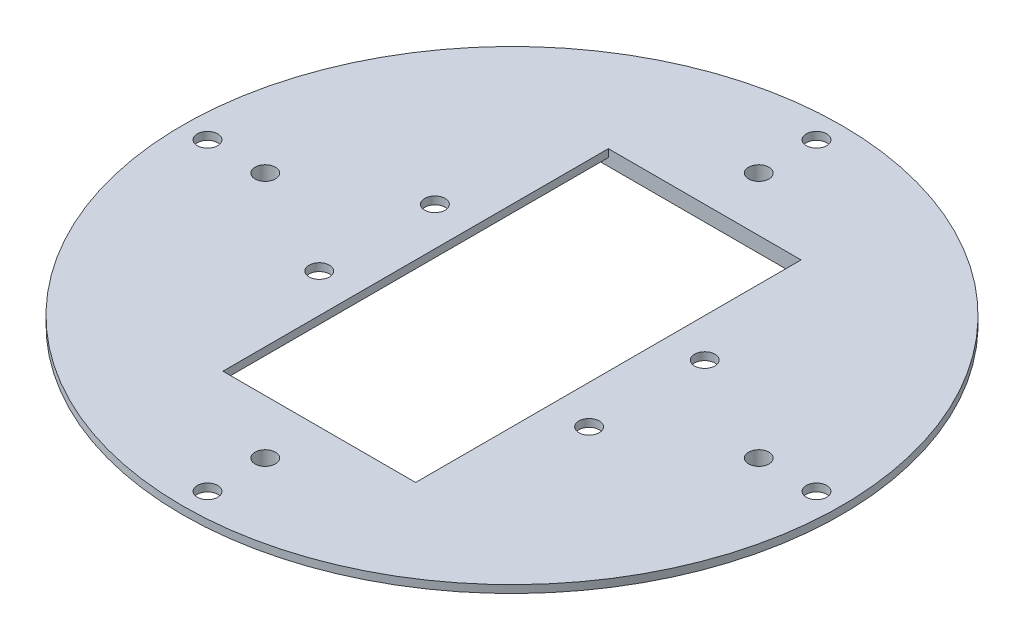
ISO-10303-21;
HEADER;
FILE_DESCRIPTION(('STEP AP214'),'2;1');
FILE_NAME('part.step','',(''),(''),'','','');
FILE_SCHEMA(('AUTOMOTIVE_DESIGN { 1 0 10303 214 1 1 1 1 }'));
ENDSEC;
DATA;
#1=APPLICATION_CONTEXT('core data for automotive mechanical design processes');
#2=APPLICATION_PROTOCOL_DEFINITION('international standard','automotive_design',2000,#1);
#3=PRODUCT_CONTEXT('',#1,'mechanical');
#4=PRODUCT('Part','Part','',(#3));
#5=PRODUCT_RELATED_PRODUCT_CATEGORY('part','',(#4));
#6=PRODUCT_DEFINITION_FORMATION('','',#4);
#7=PRODUCT_DEFINITION_CONTEXT('part definition',#1,'design');
#8=PRODUCT_DEFINITION('design','',#6,#7);
#9=PRODUCT_DEFINITION_SHAPE('','',#8);
#10=(LENGTH_UNIT() NAMED_UNIT(*) SI_UNIT(.MILLI.,.METRE.));
#11=(NAMED_UNIT(*) PLANE_ANGLE_UNIT() SI_UNIT($,.RADIAN.));
#12=(NAMED_UNIT(*) SI_UNIT($,.STERADIAN.) SOLID_ANGLE_UNIT());
#13=UNCERTAINTY_MEASURE_WITH_UNIT(LENGTH_MEASURE(1.E-05),#10,'distance_accuracy_value','');
#14=(GEOMETRIC_REPRESENTATION_CONTEXT(3) GLOBAL_UNCERTAINTY_ASSIGNED_CONTEXT((#13)) GLOBAL_UNIT_ASSIGNED_CONTEXT((#10,
#11,#12)) REPRESENTATION_CONTEXT('',''));
#15=CARTESIAN_POINT('',(0.,0.,0.));
#16=DIRECTION('',(0.,0.,1.));
#17=DIRECTION('',(1.,0.,0.));
#18=AXIS2_PLACEMENT_3D('',#15,#16,#17);
#19=CARTESIAN_POINT('',(0.,0.,0.));
#20=DIRECTION('',(0.,1.,0.));
#21=DIRECTION('',(0.,0.,1.));
#22=AXIS2_PLACEMENT_3D('',#19,#20,#21);
#23=PLANE('',#22);
#24=CARTESIAN_POINT('',(0.,0.,-79.));
#25=DIRECTION('',(0.,1.,0.));
#26=DIRECTION('',(0.,0.,1.));
#27=AXIS2_PLACEMENT_3D('',#24,#25,#26);
#28=CIRCLE('',#27,2.65);
#29=CARTESIAN_POINT('',(0.,0.,-76.35));
#30=VERTEX_POINT('',#29);
#31=EDGE_CURVE('E256',#30,#30,#28,.T.);
#32=ORIENTED_EDGE('',*,*,#31,.T.);
#33=EDGE_LOOP('',(#32));
#34=FACE_BOUND('',#33,.T.);
#35=CARTESIAN_POINT('',(-79.,0.,-8.27481077305823E-13));
#36=DIRECTION('',(0.,1.,0.));
#37=DIRECTION('',(0.,0.,1.));
#38=AXIS2_PLACEMENT_3D('',#35,#36,#37);
#39=CIRCLE('',#38,2.65);
#40=CARTESIAN_POINT('',(-79.,0.,2.64999999999917));
#41=VERTEX_POINT('',#40);
#42=EDGE_CURVE('E280',#41,#41,#39,.T.);
#43=ORIENTED_EDGE('',*,*,#42,.T.);
#44=EDGE_LOOP('',(#43));
#45=FACE_BOUND('',#44,.T.);
#46=CARTESIAN_POINT('',(-5.51654051537215E-13,0.,79.));
#47=DIRECTION('',(0.,1.,0.));
#48=DIRECTION('',(0.,0.,1.));
#49=AXIS2_PLACEMENT_3D('',#46,#47,#48);
#50=CIRCLE('',#49,2.65);
#51=CARTESIAN_POINT('',(-5.51654051537215E-13,0.,81.65));
#52=VERTEX_POINT('',#51);
#53=EDGE_CURVE('E284',#52,#52,#50,.T.);
#54=ORIENTED_EDGE('',*,*,#53,.T.);
#55=EDGE_LOOP('',(#54));
#56=FACE_BOUND('',#55,.T.);
#57=CARTESIAN_POINT('',(79.,0.,2.75827025768608E-13));
#58=DIRECTION('',(0.,1.,0.));
#59=DIRECTION('',(0.,0.,1.));
#60=AXIS2_PLACEMENT_3D('',#57,#58,#59);
#61=CIRCLE('',#60,2.65);
#62=CARTESIAN_POINT('',(79.,0.,2.65000000000027));
#63=VERTEX_POINT('',#62);
#64=EDGE_CURVE('E287',#63,#63,#61,.T.);
#65=ORIENTED_EDGE('',*,*,#64,.T.);
#66=EDGE_LOOP('',(#65));
#67=FACE_BOUND('',#66,.T.);
#68=CARTESIAN_POINT('',(0.,0.,0.));
#69=DIRECTION('',(0.,1.,0.));
#70=DIRECTION('',(0.,0.,1.));
#71=AXIS2_PLACEMENT_3D('',#68,#69,#70);
#72=CIRCLE('',#71,85.5);
#73=CARTESIAN_POINT('',(0.,0.,85.5));
#74=VERTEX_POINT('',#73);
#75=EDGE_CURVE('E51',#74,#74,#72,.T.);
#76=ORIENTED_EDGE('',*,*,#75,.F.);
#77=EDGE_LOOP('',(#76));
#78=FACE_BOUND('',#77,.T.);
#79=CARTESIAN_POINT('',(0.,0.,0.));
#80=DIRECTION('',(0.,-1.,0.));
#81=DIRECTION('',(0.,0.,-1.));
#82=AXIS2_PLACEMENT_3D('',#79,#80,#81);
#83=CIRCLE('',#82,72.5);
#84=CARTESIAN_POINT('',(0.,0.,-72.5));
#85=VERTEX_POINT('',#84);
#86=EDGE_CURVE('E11',#85,#85,#83,.T.);
#87=ORIENTED_EDGE('',*,*,#86,.F.);
#88=EDGE_LOOP('',(#87));
#89=FACE_BOUND('',#88,.T.);
#90=ADVANCED_FACE('F47',(#34,#45,#56,#67,#78,#89),#23,.F.);
#91=CARTESIAN_POINT('',(-34.9999999999999,0.,15.0000000000002));
#92=DIRECTION('',(0.,1.,0.));
#93=DIRECTION('',(0.,0.,1.));
#94=AXIS2_PLACEMENT_3D('',#91,#92,#93);
#95=CIRCLE('',#94,2.65);
#96=CARTESIAN_POINT('',(-34.9999999999999,0.,17.6500000000002));
#97=VERTEX_POINT('',#96);
#98=EDGE_CURVE('E182',#97,#97,#95,.T.);
#99=ORIENTED_EDGE('',*,*,#98,.T.);
#100=EDGE_LOOP('',(#99));
#101=FACE_BOUND('',#100,.T.);
#102=CARTESIAN_POINT('',(-35.0000000000001,0.,-14.9999999999996));
#103=DIRECTION('',(0.,1.,0.));
#104=DIRECTION('',(0.,0.,1.));
#105=AXIS2_PLACEMENT_3D('',#102,#103,#104);
#106=CIRCLE('',#105,2.65);
#107=CARTESIAN_POINT('',(-35.0000000000001,0.,-12.3499999999996));
#108=VERTEX_POINT('',#107);
#109=EDGE_CURVE('E198',#108,#108,#106,.F.);
#110=ORIENTED_EDGE('',*,*,#109,.F.);
#111=EDGE_LOOP('',(#110));
#112=FACE_BOUND('',#111,.T.);
#113=DIRECTION('',(0.,0.,-1.));
#114=VECTOR('',#113,1.);
#115=CARTESIAN_POINT('',(-25.,0.,0.));
#116=LINE('',#115,#114);
#117=CARTESIAN_POINT('',(-25.,0.,50.));
#118=VERTEX_POINT('',#117);
#119=CARTESIAN_POINT('',(-25.,0.,-50.));
#120=VERTEX_POINT('',#119);
#121=EDGE_CURVE('E206',#118,#120,#116,.T.);
#122=ORIENTED_EDGE('',*,*,#121,.F.);
#123=DIRECTION('',(-1.,0.,0.));
#124=VECTOR('',#123,1.);
#125=CARTESIAN_POINT('',(-50.,0.,50.));
#126=LINE('',#125,#124);
#127=CARTESIAN_POINT('',(-50.,0.,50.));
#128=VERTEX_POINT('',#127);
#129=EDGE_CURVE('E57',#118,#128,#126,.T.);
#130=ORIENTED_EDGE('',*,*,#129,.T.);
#131=DIRECTION('',(0.,0.,-1.));
#132=VECTOR('',#131,1.);
#133=CARTESIAN_POINT('',(-50.,0.,-50.));
#134=LINE('',#133,#132);
#135=CARTESIAN_POINT('',(-50.,0.,-50.));
#136=VERTEX_POINT('',#135);
#137=EDGE_CURVE('E156',#128,#136,#134,.T.);
#138=ORIENTED_EDGE('',*,*,#137,.T.);
#139=DIRECTION('',(1.,0.,0.));
#140=VECTOR('',#139,1.);
#141=CARTESIAN_POINT('',(-50.,0.,-50.));
#142=LINE('',#141,#140);
#143=EDGE_CURVE('E125',#136,#120,#142,.T.);
#144=ORIENTED_EDGE('',*,*,#143,.T.);
#145=EDGE_LOOP('',(#122,#130,#138,#144));
#146=FACE_BOUND('',#145,.T.);
#147=ADVANCED_FACE('F300',(#101,#112,#146),#23,.F.);
#148=CARTESIAN_POINT('',(0.,2.,0.));
#149=DIRECTION('',(0.,1.,0.));
#150=DIRECTION('',(0.,0.,1.));
#151=AXIS2_PLACEMENT_3D('',#148,#149,#150);
#152=PLANE('',#151);
#153=CARTESIAN_POINT('',(35.,2.,15.));
#154=DIRECTION('',(0.,1.,0.));
#155=DIRECTION('',(0.,0.,1.));
#156=AXIS2_PLACEMENT_3D('',#153,#154,#155);
#157=CIRCLE('',#156,2.65);
#158=CARTESIAN_POINT('',(35.,2.,17.65));
#159=VERTEX_POINT('',#158);
#160=EDGE_CURVE('E172',#159,#159,#157,.F.);
#161=ORIENTED_EDGE('',*,*,#160,.T.);
#162=EDGE_LOOP('',(#161));
#163=FACE_BOUND('',#162,.T.);
#164=CARTESIAN_POINT('',(-35.0000000000001,2.,-14.9999999999996));
#165=DIRECTION('',(0.,1.,0.));
#166=DIRECTION('',(0.,0.,1.));
#167=AXIS2_PLACEMENT_3D('',#164,#165,#166);
#168=CIRCLE('',#167,2.65);
#169=CARTESIAN_POINT('',(-35.0000000000001,2.,-12.3499999999996));
#170=VERTEX_POINT('',#169);
#171=EDGE_CURVE('E186',#170,#170,#168,.F.);
#172=ORIENTED_EDGE('',*,*,#171,.T.);
#173=EDGE_LOOP('',(#172));
#174=FACE_BOUND('',#173,.T.);
#175=DIRECTION('',(0.,0.,-1.));
#176=VECTOR('',#175,1.);
#177=CARTESIAN_POINT('',(-25.,2.,0.));
#178=LINE('',#177,#176);
#179=CARTESIAN_POINT('',(-25.,2.,50.));
#180=VERTEX_POINT('',#179);
#181=CARTESIAN_POINT('',(-25.,2.,-50.));
#182=VERTEX_POINT('',#181);
#183=EDGE_CURVE('E211',#180,#182,#178,.T.);
#184=ORIENTED_EDGE('',*,*,#183,.T.);
#185=DIRECTION('',(1.,0.,0.));
#186=VECTOR('',#185,1.);
#187=CARTESIAN_POINT('',(0.,2.,-50.));
#188=LINE('',#187,#186);
#189=CARTESIAN_POINT('',(25.,2.,-50.));
#190=VERTEX_POINT('',#189);
#191=EDGE_CURVE('E239',#182,#190,#188,.T.);
#192=ORIENTED_EDGE('',*,*,#191,.T.);
#193=DIRECTION('',(0.,0.,-1.));
#194=VECTOR('',#193,1.);
#195=CARTESIAN_POINT('',(25.,2.,0.));
#196=LINE('',#195,#194);
#197=CARTESIAN_POINT('',(25.,2.,50.));
#198=VERTEX_POINT('',#197);
#199=EDGE_CURVE('E202',#198,#190,#196,.T.);
#200=ORIENTED_EDGE('',*,*,#199,.F.);
#201=DIRECTION('',(1.,0.,0.));
#202=VECTOR('',#201,1.);
#203=CARTESIAN_POINT('',(0.,2.,50.));
#204=LINE('',#203,#202);
#205=EDGE_CURVE('E253',#180,#198,#204,.T.);
#206=ORIENTED_EDGE('',*,*,#205,.F.);
#207=EDGE_LOOP('',(#184,#192,#200,#206));
#208=FACE_BOUND('',#207,.T.);
#209=CARTESIAN_POINT('',(0.,2.,-64.0312423743285));
#210=DIRECTION('',(0.,1.,0.));
#211=DIRECTION('',(0.,0.,1.));
#212=AXIS2_PLACEMENT_3D('',#209,#210,#211);
#213=CIRCLE('',#212,2.65);
#214=CARTESIAN_POINT('',(0.,2.,-61.3812423743285));
#215=VERTEX_POINT('',#214);
#216=EDGE_CURVE('E235',#215,#215,#213,.T.);
#217=ORIENTED_EDGE('',*,*,#216,.F.);
#218=EDGE_LOOP('',(#217));
#219=FACE_BOUND('',#218,.T.);
#220=CARTESIAN_POINT('',(-64.0312423743285,2.,-6.70691663558729E-13));
#221=DIRECTION('',(0.,1.,0.));
#222=DIRECTION('',(0.,0.,1.));
#223=AXIS2_PLACEMENT_3D('',#220,#221,#222);
#224=CIRCLE('',#223,2.65);
#225=CARTESIAN_POINT('',(-64.0312423743285,2.,2.64999999999933));
#226=VERTEX_POINT('',#225);
#227=EDGE_CURVE('E240',#226,#226,#224,.T.);
#228=ORIENTED_EDGE('',*,*,#227,.F.);
#229=EDGE_LOOP('',(#228));
#230=FACE_BOUND('',#229,.T.);
#231=CARTESIAN_POINT('',(64.0312423743285,2.,2.2356388785291E-13));
#232=DIRECTION('',(0.,1.,0.));
#233=DIRECTION('',(0.,0.,1.));
#234=AXIS2_PLACEMENT_3D('',#231,#232,#233);
#235=CIRCLE('',#234,2.65);
#236=CARTESIAN_POINT('',(64.0312423743285,2.,2.65000000000022));
#237=VERTEX_POINT('',#236);
#238=EDGE_CURVE('E244',#237,#237,#235,.T.);
#239=ORIENTED_EDGE('',*,*,#238,.F.);
#240=EDGE_LOOP('',(#239));
#241=FACE_BOUND('',#240,.T.);
#242=CARTESIAN_POINT('',(-4.47127775705819E-13,2.,64.0312423743285));
#243=DIRECTION('',(0.,1.,0.));
#244=DIRECTION('',(0.,0.,1.));
#245=AXIS2_PLACEMENT_3D('',#242,#243,#244);
#246=CIRCLE('',#245,2.65);
#247=CARTESIAN_POINT('',(-4.47127775705819E-13,2.,66.6812423743285));
#248=VERTEX_POINT('',#247);
#249=EDGE_CURVE('E218',#248,#248,#246,.T.);
#250=ORIENTED_EDGE('',*,*,#249,.F.);
#251=EDGE_LOOP('',(#250));
#252=FACE_BOUND('',#251,.T.);
#253=CARTESIAN_POINT('',(0.,2.,-79.));
#254=DIRECTION('',(0.,1.,0.));
#255=DIRECTION('',(0.,0.,1.));
#256=AXIS2_PLACEMENT_3D('',#253,#254,#255);
#257=CIRCLE('',#256,2.65);
#258=CARTESIAN_POINT('',(0.,2.,-76.35));
#259=VERTEX_POINT('',#258);
#260=EDGE_CURVE('E257',#259,#259,#257,.T.);
#261=ORIENTED_EDGE('',*,*,#260,.F.);
#262=EDGE_LOOP('',(#261));
#263=FACE_BOUND('',#262,.T.);
#264=CARTESIAN_POINT('',(-79.,2.,-8.27481077305823E-13));
#265=DIRECTION('',(0.,1.,0.));
#266=DIRECTION('',(0.,0.,1.));
#267=AXIS2_PLACEMENT_3D('',#264,#265,#266);
#268=CIRCLE('',#267,2.65);
#269=CARTESIAN_POINT('',(-79.,2.,2.64999999999917));
#270=VERTEX_POINT('',#269);
#271=EDGE_CURVE('E261',#270,#270,#268,.T.);
#272=ORIENTED_EDGE('',*,*,#271,.F.);
#273=EDGE_LOOP('',(#272));
#274=FACE_BOUND('',#273,.T.);
#275=CARTESIAN_POINT('',(-5.51654051537215E-13,2.,79.));
#276=DIRECTION('',(0.,1.,0.));
#277=DIRECTION('',(0.,0.,1.));
#278=AXIS2_PLACEMENT_3D('',#275,#276,#277);
#279=CIRCLE('',#278,2.65);
#280=CARTESIAN_POINT('',(-5.51654051537215E-13,2.,81.65));
#281=VERTEX_POINT('',#280);
#282=EDGE_CURVE('E265',#281,#281,#279,.T.);
#283=ORIENTED_EDGE('',*,*,#282,.F.);
#284=EDGE_LOOP('',(#283));
#285=FACE_BOUND('',#284,.T.);
#286=CARTESIAN_POINT('',(79.,2.,2.75827025768608E-13));
#287=DIRECTION('',(0.,1.,0.));
#288=DIRECTION('',(0.,0.,1.));
#289=AXIS2_PLACEMENT_3D('',#286,#287,#288);
#290=CIRCLE('',#289,2.65);
#291=CARTESIAN_POINT('',(79.,2.,2.65000000000027));
#292=VERTEX_POINT('',#291);
#293=EDGE_CURVE('E269',#292,#292,#290,.T.);
#294=ORIENTED_EDGE('',*,*,#293,.F.);
#295=EDGE_LOOP('',(#294));
#296=FACE_BOUND('',#295,.T.);
#297=CARTESIAN_POINT('',(0.,2.,0.));
#298=DIRECTION('',(0.,1.,0.));
#299=DIRECTION('',(0.,0.,1.));
#300=AXIS2_PLACEMENT_3D('',#297,#298,#299);
#301=CIRCLE('',#300,85.5);
#302=CARTESIAN_POINT('',(0.,2.,85.5));
#303=VERTEX_POINT('',#302);
#304=EDGE_CURVE('E273',#303,#303,#301,.T.);
#305=ORIENTED_EDGE('',*,*,#304,.T.);
#306=EDGE_LOOP('',(#305));
#307=FACE_BOUND('',#306,.T.);
#308=CARTESIAN_POINT('',(35.,2.,-15.));
#309=DIRECTION('',(0.,1.,0.));
#310=DIRECTION('',(0.,0.,1.));
#311=AXIS2_PLACEMENT_3D('',#308,#309,#310);
#312=CIRCLE('',#311,2.65);
#313=CARTESIAN_POINT('',(35.,2.,-12.35));
#314=VERTEX_POINT('',#313);
#315=EDGE_CURVE('E178',#314,#314,#312,.T.);
#316=ORIENTED_EDGE('',*,*,#315,.F.);
#317=EDGE_LOOP('',(#316));
#318=FACE_BOUND('',#317,.T.);
#319=CARTESIAN_POINT('',(-34.9999999999999,2.,15.0000000000002));
#320=DIRECTION('',(0.,1.,0.));
#321=DIRECTION('',(0.,0.,1.));
#322=AXIS2_PLACEMENT_3D('',#319,#320,#321);
#323=CIRCLE('',#322,2.65);
#324=CARTESIAN_POINT('',(-34.9999999999999,2.,17.6500000000002));
#325=VERTEX_POINT('',#324);
#326=EDGE_CURVE('E187',#325,#325,#323,.T.);
#327=ORIENTED_EDGE('',*,*,#326,.F.);
#328=EDGE_LOOP('',(#327));
#329=FACE_BOUND('',#328,.T.);
#330=ADVANCED_FACE('F366',(#163,#174,#208,#219,#230,#241,#252,#263,#274,#285,#296,#307,#318,
#329),#152,.T.);
#331=CARTESIAN_POINT('',(35.,0.,-15.));
#332=DIRECTION('',(0.,1.,0.));
#333=DIRECTION('',(0.,0.,1.));
#334=AXIS2_PLACEMENT_3D('',#331,#332,#333);
#335=CIRCLE('',#334,2.65);
#336=CARTESIAN_POINT('',(35.,0.,-12.35));
#337=VERTEX_POINT('',#336);
#338=EDGE_CURVE('E191',#337,#337,#335,.T.);
#339=ORIENTED_EDGE('',*,*,#338,.T.);
#340=EDGE_LOOP('',(#339));
#341=FACE_BOUND('',#340,.T.);
#342=CARTESIAN_POINT('',(35.,0.,15.));
#343=DIRECTION('',(0.,1.,0.));
#344=DIRECTION('',(0.,0.,1.));
#345=AXIS2_PLACEMENT_3D('',#342,#343,#344);
#346=CIRCLE('',#345,2.65);
#347=CARTESIAN_POINT('',(35.,0.,17.65));
#348=VERTEX_POINT('',#347);
#349=EDGE_CURVE('E174',#348,#348,#346,.F.);
#350=ORIENTED_EDGE('',*,*,#349,.F.);
#351=EDGE_LOOP('',(#350));
#352=FACE_BOUND('',#351,.T.);
#353=DIRECTION('',(0.,0.,1.));
#354=VECTOR('',#353,1.);
#355=CARTESIAN_POINT('',(50.,0.,-50.));
#356=LINE('',#355,#354);
#357=CARTESIAN_POINT('',(50.,0.,-50.));
#358=VERTEX_POINT('',#357);
#359=CARTESIAN_POINT('',(50.,0.,50.));
#360=VERTEX_POINT('',#359);
#361=EDGE_CURVE('E150',#358,#360,#356,.T.);
#362=ORIENTED_EDGE('',*,*,#361,.T.);
#363=CARTESIAN_POINT('',(25.,0.,50.));
#364=VERTEX_POINT('',#363);
#365=EDGE_CURVE('E131',#360,#364,#126,.T.);
#366=ORIENTED_EDGE('',*,*,#365,.T.);
#367=DIRECTION('',(0.,0.,-1.));
#368=VECTOR('',#367,1.);
#369=CARTESIAN_POINT('',(25.,0.,0.));
#370=LINE('',#369,#368);
#371=CARTESIAN_POINT('',(25.,0.,-50.));
#372=VERTEX_POINT('',#371);
#373=EDGE_CURVE('E222',#364,#372,#370,.T.);
#374=ORIENTED_EDGE('',*,*,#373,.T.);
#375=EDGE_CURVE('E162',#372,#358,#142,.T.);
#376=ORIENTED_EDGE('',*,*,#375,.T.);
#377=EDGE_LOOP('',(#362,#366,#374,#376));
#378=FACE_BOUND('',#377,.T.);
#379=ADVANCED_FACE('F303',(#341,#352,#378),#23,.F.);
#380=CARTESIAN_POINT('',(0.,0.,-50.));
#381=DIRECTION('',(0.,0.,1.));
#382=DIRECTION('',(1.,0.,0.));
#383=AXIS2_PLACEMENT_3D('',#380,#381,#382);
#384=PLANE('',#383);
#385=DIRECTION('',(0.,1.,0.));
#386=VECTOR('',#385,1.);
#387=CARTESIAN_POINT('',(-25.,0.,-50.));
#388=LINE('',#387,#386);
#389=EDGE_CURVE('E215',#120,#182,#388,.T.);
#390=ORIENTED_EDGE('',*,*,#389,.F.);
#391=ORIENTED_EDGE('',*,*,#143,.F.);
#392=DIRECTION('',(0.,1.,0.));
#393=VECTOR('',#392,1.);
#394=CARTESIAN_POINT('',(-50.,-2.,-50.));
#395=LINE('',#394,#393);
#396=CARTESIAN_POINT('',(-50.,-2.,-50.));
#397=VERTEX_POINT('',#396);
#398=EDGE_CURVE('E165',#397,#136,#395,.T.);
#399=ORIENTED_EDGE('',*,*,#398,.F.);
#400=DIRECTION('',(1.,0.,0.));
#401=VECTOR('',#400,1.);
#402=CARTESIAN_POINT('',(-50.,-2.,-50.));
#403=LINE('',#402,#401);
#404=CARTESIAN_POINT('',(50.,-2.,-50.));
#405=VERTEX_POINT('',#404);
#406=EDGE_CURVE('E144',#397,#405,#403,.T.);
#407=ORIENTED_EDGE('',*,*,#406,.T.);
#408=DIRECTION('',(0.,1.,0.));
#409=VECTOR('',#408,1.);
#410=CARTESIAN_POINT('',(50.,-2.,-50.));
#411=LINE('',#410,#409);
#412=EDGE_CURVE('E65',#405,#358,#411,.T.);
#413=ORIENTED_EDGE('',*,*,#412,.T.);
#414=ORIENTED_EDGE('',*,*,#375,.F.);
#415=DIRECTION('',(0.,1.,0.));
#416=VECTOR('',#415,1.);
#417=CARTESIAN_POINT('',(25.,0.,-50.));
#418=LINE('',#417,#416);
#419=EDGE_CURVE('E71',#372,#190,#418,.T.);
#420=ORIENTED_EDGE('',*,*,#419,.T.);
#421=ORIENTED_EDGE('',*,*,#191,.F.);
#422=EDGE_LOOP('',(#390,#391,#399,#407,#413,#414,#420,#421));
#423=FACE_BOUND('',#422,.T.);
#424=ADVANCED_FACE('F363',(#423),#384,.T.);
#425=CARTESIAN_POINT('',(0.,0.,50.));
#426=DIRECTION('',(0.,0.,1.));
#427=DIRECTION('',(1.,0.,0.));
#428=AXIS2_PLACEMENT_3D('',#425,#426,#427);
#429=PLANE('',#428);
#430=DIRECTION('',(0.,1.,0.));
#431=VECTOR('',#430,1.);
#432=CARTESIAN_POINT('',(25.,0.,50.));
#433=LINE('',#432,#431);
#434=EDGE_CURVE('E226',#364,#198,#433,.T.);
#435=ORIENTED_EDGE('',*,*,#434,.F.);
#436=ORIENTED_EDGE('',*,*,#365,.F.);
#437=DIRECTION('',(0.,1.,0.));
#438=VECTOR('',#437,1.);
#439=CARTESIAN_POINT('',(50.,-2.,50.));
#440=LINE('',#439,#438);
#441=CARTESIAN_POINT('',(50.,-2.,50.));
#442=VERTEX_POINT('',#441);
#443=EDGE_CURVE('E118',#442,#360,#440,.T.);
#444=ORIENTED_EDGE('',*,*,#443,.F.);
#445=DIRECTION('',(-1.,0.,0.));
#446=VECTOR('',#445,1.);
#447=CARTESIAN_POINT('',(-50.,-2.,50.));
#448=LINE('',#447,#446);
#449=CARTESIAN_POINT('',(-50.,-2.,50.));
#450=VERTEX_POINT('',#449);
#451=EDGE_CURVE('E124',#442,#450,#448,.T.);
#452=ORIENTED_EDGE('',*,*,#451,.T.);
#453=DIRECTION('',(0.,1.,0.));
#454=VECTOR('',#453,1.);
#455=CARTESIAN_POINT('',(-50.,-2.,50.));
#456=LINE('',#455,#454);
#457=EDGE_CURVE('E134',#450,#128,#456,.T.);
#458=ORIENTED_EDGE('',*,*,#457,.T.);
#459=ORIENTED_EDGE('',*,*,#129,.F.);
#460=DIRECTION('',(0.,1.,0.));
#461=VECTOR('',#460,1.);
#462=CARTESIAN_POINT('',(-25.,0.,50.));
#463=LINE('',#462,#461);
#464=EDGE_CURVE('E210',#118,#180,#463,.T.);
#465=ORIENTED_EDGE('',*,*,#464,.T.);
#466=ORIENTED_EDGE('',*,*,#205,.T.);
#467=EDGE_LOOP('',(#435,#436,#444,#452,#458,#459,#465,#466));
#468=FACE_BOUND('',#467,.T.);
#469=ADVANCED_FACE('F129',(#468),#429,.F.);
#470=CARTESIAN_POINT('',(79.,2.,2.75827025768608E-13));
#471=DIRECTION('',(0.,-1.,0.));
#472=DIRECTION('',(0.,0.,-1.));
#473=AXIS2_PLACEMENT_3D('',#470,#471,#472);
#474=CYLINDRICAL_SURFACE('',#473,2.65);
#475=ORIENTED_EDGE('',*,*,#293,.T.);
#476=EDGE_LOOP('',(#475));
#477=FACE_BOUND('',#476,.T.);
#478=ORIENTED_EDGE('',*,*,#64,.F.);
#479=EDGE_LOOP('',(#478));
#480=FACE_BOUND('',#479,.T.);
#481=ADVANCED_FACE('F362',(#477,#480),#474,.F.);
#482=CARTESIAN_POINT('',(-5.51654051537215E-13,2.,79.));
#483=DIRECTION('',(0.,-1.,0.));
#484=DIRECTION('',(0.,0.,-1.));
#485=AXIS2_PLACEMENT_3D('',#482,#483,#484);
#486=CYLINDRICAL_SURFACE('',#485,2.65);
#487=ORIENTED_EDGE('',*,*,#282,.T.);
#488=EDGE_LOOP('',(#487));
#489=FACE_BOUND('',#488,.T.);
#490=ORIENTED_EDGE('',*,*,#53,.F.);
#491=EDGE_LOOP('',(#490));
#492=FACE_BOUND('',#491,.T.);
#493=ADVANCED_FACE('F377',(#489,#492),#486,.F.);
#494=CARTESIAN_POINT('',(-79.,2.,-8.27481077305823E-13));
#495=DIRECTION('',(0.,-1.,0.));
#496=DIRECTION('',(0.,0.,-1.));
#497=AXIS2_PLACEMENT_3D('',#494,#495,#496);
#498=CYLINDRICAL_SURFACE('',#497,2.65);
#499=ORIENTED_EDGE('',*,*,#271,.T.);
#500=EDGE_LOOP('',(#499));
#501=FACE_BOUND('',#500,.T.);
#502=ORIENTED_EDGE('',*,*,#42,.F.);
#503=EDGE_LOOP('',(#502));
#504=FACE_BOUND('',#503,.T.);
#505=ADVANCED_FACE('F380',(#501,#504),#498,.F.);
#506=CARTESIAN_POINT('',(0.,2.,-79.));
#507=DIRECTION('',(0.,-1.,0.));
#508=DIRECTION('',(0.,0.,-1.));
#509=AXIS2_PLACEMENT_3D('',#506,#507,#508);
#510=CYLINDRICAL_SURFACE('',#509,2.65);
#511=ORIENTED_EDGE('',*,*,#260,.T.);
#512=EDGE_LOOP('',(#511));
#513=FACE_BOUND('',#512,.T.);
#514=ORIENTED_EDGE('',*,*,#31,.F.);
#515=EDGE_LOOP('',(#514));
#516=FACE_BOUND('',#515,.T.);
#517=ADVANCED_FACE('F49',(#513,#516),#510,.F.);
#518=CARTESIAN_POINT('',(0.,2.,0.));
#519=DIRECTION('',(0.,-1.,0.));
#520=DIRECTION('',(0.,0.,-1.));
#521=AXIS2_PLACEMENT_3D('',#518,#519,#520);
#522=CYLINDRICAL_SURFACE('',#521,85.5);
#523=ORIENTED_EDGE('',*,*,#304,.F.);
#524=EDGE_LOOP('',(#523));
#525=FACE_BOUND('',#524,.T.);
#526=ORIENTED_EDGE('',*,*,#75,.T.);
#527=EDGE_LOOP('',(#526));
#528=FACE_BOUND('',#527,.T.);
#529=ADVANCED_FACE('F296',(#525,#528),#522,.T.);
#530=CARTESIAN_POINT('',(-4.47127775705819E-13,0.,64.0312423743285));
#531=DIRECTION('',(0.,1.,0.));
#532=DIRECTION('',(0.,0.,1.));
#533=AXIS2_PLACEMENT_3D('',#530,#531,#532);
#534=CYLINDRICAL_SURFACE('',#533,2.65);
#535=ORIENTED_EDGE('',*,*,#249,.T.);
#536=EDGE_LOOP('',(#535));
#537=FACE_BOUND('',#536,.T.);
#538=CARTESIAN_POINT('',(-4.47127775705819E-13,-2.,64.0312423743285));
#539=DIRECTION('',(0.,-1.,0.));
#540=DIRECTION('',(0.,0.,-1.));
#541=AXIS2_PLACEMENT_3D('',#538,#539,#540);
#542=CIRCLE('',#541,2.65);
#543=CARTESIAN_POINT('',(-4.47127775705819E-13,-2.,61.3812423743285));
#544=VERTEX_POINT('',#543);
#545=EDGE_CURVE('E153',#544,#544,#542,.T.);
#546=ORIENTED_EDGE('',*,*,#545,.T.);
#547=EDGE_LOOP('',(#546));
#548=FACE_BOUND('',#547,.T.);
#549=ADVANCED_FACE('F355',(#537,#548),#534,.F.);
#550=CARTESIAN_POINT('',(64.0312423743285,0.,2.2356388785291E-13));
#551=DIRECTION('',(0.,1.,0.));
#552=DIRECTION('',(0.,0.,1.));
#553=AXIS2_PLACEMENT_3D('',#550,#551,#552);
#554=CYLINDRICAL_SURFACE('',#553,2.65);
#555=ORIENTED_EDGE('',*,*,#238,.T.);
#556=EDGE_LOOP('',(#555));
#557=FACE_BOUND('',#556,.T.);
#558=CARTESIAN_POINT('',(64.0312423743285,-2.,2.2356388785291E-13));
#559=DIRECTION('',(0.,-1.,0.));
#560=DIRECTION('',(0.,0.,-1.));
#561=AXIS2_PLACEMENT_3D('',#558,#559,#560);
#562=CIRCLE('',#561,2.65);
#563=CARTESIAN_POINT('',(64.0312423743285,-2.,-2.64999999999978));
#564=VERTEX_POINT('',#563);
#565=EDGE_CURVE('E569',#564,#564,#562,.T.);
#566=ORIENTED_EDGE('',*,*,#565,.T.);
#567=EDGE_LOOP('',(#566));
#568=FACE_BOUND('',#567,.T.);
#569=ADVANCED_FACE('F351',(#557,#568),#554,.F.);
#570=CARTESIAN_POINT('',(-64.0312423743285,0.,-6.70691663558729E-13));
#571=DIRECTION('',(0.,1.,0.));
#572=DIRECTION('',(0.,0.,1.));
#573=AXIS2_PLACEMENT_3D('',#570,#571,#572);
#574=CYLINDRICAL_SURFACE('',#573,2.65);
#575=ORIENTED_EDGE('',*,*,#227,.T.);
#576=EDGE_LOOP('',(#575));
#577=FACE_BOUND('',#576,.T.);
#578=CARTESIAN_POINT('',(-64.0312423743285,-2.,-6.70691663558729E-13));
#579=DIRECTION('',(0.,-1.,0.));
#580=DIRECTION('',(0.,0.,-1.));
#581=AXIS2_PLACEMENT_3D('',#578,#579,#580);
#582=CIRCLE('',#581,2.65);
#583=CARTESIAN_POINT('',(-64.0312423743285,-2.,-2.65000000000067));
#584=VERTEX_POINT('',#583);
#585=EDGE_CURVE('E560',#584,#584,#582,.T.);
#586=ORIENTED_EDGE('',*,*,#585,.T.);
#587=EDGE_LOOP('',(#586));
#588=FACE_BOUND('',#587,.T.);
#589=ADVANCED_FACE('F347',(#577,#588),#574,.F.);
#590=CARTESIAN_POINT('',(0.,0.,-64.0312423743285));
#591=DIRECTION('',(0.,1.,0.));
#592=DIRECTION('',(0.,0.,1.));
#593=AXIS2_PLACEMENT_3D('',#590,#591,#592);
#594=CYLINDRICAL_SURFACE('',#593,2.65);
#595=ORIENTED_EDGE('',*,*,#216,.T.);
#596=EDGE_LOOP('',(#595));
#597=FACE_BOUND('',#596,.T.);
#598=CARTESIAN_POINT('',(0.,-2.,-64.0312423743285));
#599=DIRECTION('',(0.,-1.,0.));
#600=DIRECTION('',(0.,0.,-1.));
#601=AXIS2_PLACEMENT_3D('',#598,#599,#600);
#602=CIRCLE('',#601,2.65);
#603=CARTESIAN_POINT('',(0.,-2.,-66.6812423743285));
#604=VERTEX_POINT('',#603);
#605=EDGE_CURVE('E563',#604,#604,#602,.T.);
#606=ORIENTED_EDGE('',*,*,#605,.T.);
#607=EDGE_LOOP('',(#606));
#608=FACE_BOUND('',#607,.T.);
#609=ADVANCED_FACE('F340',(#597,#608),#594,.F.);
#610=CARTESIAN_POINT('',(-25.,0.,0.));
#611=DIRECTION('',(1.,0.,0.));
#612=DIRECTION('',(0.,0.,-1.));
#613=AXIS2_PLACEMENT_3D('',#610,#611,#612);
#614=PLANE('',#613);
#615=ORIENTED_EDGE('',*,*,#183,.F.);
#616=ORIENTED_EDGE('',*,*,#464,.F.);
#617=ORIENTED_EDGE('',*,*,#121,.T.);
#618=ORIENTED_EDGE('',*,*,#389,.T.);
#619=EDGE_LOOP('',(#615,#616,#617,#618));
#620=FACE_BOUND('',#619,.T.);
#621=ADVANCED_FACE('F337',(#620),#614,.T.);
#622=CARTESIAN_POINT('',(25.,0.,0.));
#623=DIRECTION('',(1.,0.,0.));
#624=DIRECTION('',(0.,0.,-1.));
#625=AXIS2_PLACEMENT_3D('',#622,#623,#624);
#626=PLANE('',#625);
#627=ORIENTED_EDGE('',*,*,#199,.T.);
#628=ORIENTED_EDGE('',*,*,#419,.F.);
#629=ORIENTED_EDGE('',*,*,#373,.F.);
#630=ORIENTED_EDGE('',*,*,#434,.T.);
#631=EDGE_LOOP('',(#627,#628,#629,#630));
#632=FACE_BOUND('',#631,.T.);
#633=ADVANCED_FACE('F335',(#632),#626,.F.);
#634=CARTESIAN_POINT('',(-35.0000000000001,0.,-14.9999999999996));
#635=DIRECTION('',(0.,1.,0.));
#636=DIRECTION('',(0.,0.,1.));
#637=AXIS2_PLACEMENT_3D('',#634,#635,#636);
#638=CYLINDRICAL_SURFACE('',#637,2.65);
#639=ORIENTED_EDGE('',*,*,#109,.T.);
#640=EDGE_LOOP('',(#639));
#641=FACE_BOUND('',#640,.T.);
#642=ORIENTED_EDGE('',*,*,#171,.F.);
#643=EDGE_LOOP('',(#642));
#644=FACE_BOUND('',#643,.T.);
#645=ADVANCED_FACE('F325',(#641,#644),#638,.F.);
#646=CARTESIAN_POINT('',(35.,0.,15.));
#647=DIRECTION('',(0.,1.,0.));
#648=DIRECTION('',(0.,0.,1.));
#649=AXIS2_PLACEMENT_3D('',#646,#647,#648);
#650=CYLINDRICAL_SURFACE('',#649,2.65);
#651=ORIENTED_EDGE('',*,*,#349,.T.);
#652=EDGE_LOOP('',(#651));
#653=FACE_BOUND('',#652,.T.);
#654=ORIENTED_EDGE('',*,*,#160,.F.);
#655=EDGE_LOOP('',(#654));
#656=FACE_BOUND('',#655,.T.);
#657=ADVANCED_FACE('F321',(#653,#656),#650,.F.);
#658=CARTESIAN_POINT('',(35.,0.,-15.));
#659=DIRECTION('',(0.,1.,0.));
#660=DIRECTION('',(0.,0.,1.));
#661=AXIS2_PLACEMENT_3D('',#658,#659,#660);
#662=CYLINDRICAL_SURFACE('',#661,2.65);
#663=ORIENTED_EDGE('',*,*,#338,.F.);
#664=EDGE_LOOP('',(#663));
#665=FACE_BOUND('',#664,.T.);
#666=ORIENTED_EDGE('',*,*,#315,.T.);
#667=EDGE_LOOP('',(#666));
#668=FACE_BOUND('',#667,.T.);
#669=ADVANCED_FACE('F324',(#665,#668),#662,.F.);
#670=CARTESIAN_POINT('',(-34.9999999999999,0.,15.0000000000002));
#671=DIRECTION('',(0.,1.,0.));
#672=DIRECTION('',(0.,0.,1.));
#673=AXIS2_PLACEMENT_3D('',#670,#671,#672);
#674=CYLINDRICAL_SURFACE('',#673,2.65);
#675=ORIENTED_EDGE('',*,*,#98,.F.);
#676=EDGE_LOOP('',(#675));
#677=FACE_BOUND('',#676,.T.);
#678=ORIENTED_EDGE('',*,*,#326,.T.);
#679=EDGE_LOOP('',(#678));
#680=FACE_BOUND('',#679,.T.);
#681=ADVANCED_FACE('F316',(#677,#680),#674,.F.);
#682=CARTESIAN_POINT('',(0.,-2.,0.));
#683=DIRECTION('',(0.,-1.,0.));
#684=DIRECTION('',(0.,0.,-1.));
#685=AXIS2_PLACEMENT_3D('',#682,#683,#684);
#686=PLANE('',#685);
#687=ORIENTED_EDGE('',*,*,#605,.F.);
#688=EDGE_LOOP('',(#687));
#689=FACE_BOUND('',#688,.T.);
#690=ORIENTED_EDGE('',*,*,#545,.F.);
#691=EDGE_LOOP('',(#690));
#692=FACE_BOUND('',#691,.T.);
#693=CARTESIAN_POINT('',(0.,-2.,0.));
#694=DIRECTION('',(0.,-1.,0.));
#695=DIRECTION('',(0.,0.,-1.));
#696=AXIS2_PLACEMENT_3D('',#693,#694,#695);
#697=CIRCLE('',#696,72.5);
#698=CARTESIAN_POINT('',(0.,-2.,-72.5));
#699=VERTEX_POINT('',#698);
#700=EDGE_CURVE('E133',#699,#699,#697,.T.);
#701=ORIENTED_EDGE('',*,*,#700,.T.);
#702=EDGE_LOOP('',(#701));
#703=FACE_BOUND('',#702,.T.);
#704=ORIENTED_EDGE('',*,*,#451,.F.);
#705=DIRECTION('',(0.,0.,1.));
#706=VECTOR('',#705,1.);
#707=CARTESIAN_POINT('',(50.,-2.,-50.));
#708=LINE('',#707,#706);
#709=EDGE_CURVE('E115',#405,#442,#708,.T.);
#710=ORIENTED_EDGE('',*,*,#709,.F.);
#711=ORIENTED_EDGE('',*,*,#406,.F.);
#712=DIRECTION('',(0.,0.,-1.));
#713=VECTOR('',#712,1.);
#714=CARTESIAN_POINT('',(-50.,-2.,-50.));
#715=LINE('',#714,#713);
#716=EDGE_CURVE('E140',#450,#397,#715,.T.);
#717=ORIENTED_EDGE('',*,*,#716,.F.);
#718=EDGE_LOOP('',(#704,#710,#711,#717));
#719=FACE_BOUND('',#718,.T.);
#720=ORIENTED_EDGE('',*,*,#585,.F.);
#721=EDGE_LOOP('',(#720));
#722=FACE_BOUND('',#721,.T.);
#723=ORIENTED_EDGE('',*,*,#565,.F.);
#724=EDGE_LOOP('',(#723));
#725=FACE_BOUND('',#724,.T.);
#726=ADVANCED_FACE('F137',(#689,#692,#703,#719,#722,#725),#686,.T.);
#727=CARTESIAN_POINT('',(0.,-2.,0.));
#728=DIRECTION('',(0.,1.,0.));
#729=DIRECTION('',(0.,0.,1.));
#730=AXIS2_PLACEMENT_3D('',#727,#728,#729);
#731=CYLINDRICAL_SURFACE('',#730,72.5);
#732=ORIENTED_EDGE('',*,*,#700,.F.);
#733=EDGE_LOOP('',(#732));
#734=FACE_BOUND('',#733,.T.);
#735=ORIENTED_EDGE('',*,*,#86,.T.);
#736=EDGE_LOOP('',(#735));
#737=FACE_BOUND('',#736,.T.);
#738=ADVANCED_FACE('F306',(#734,#737),#731,.T.);
#739=CARTESIAN_POINT('',(50.,-2.,-50.));
#740=DIRECTION('',(-1.,0.,0.));
#741=DIRECTION('',(0.,0.,1.));
#742=AXIS2_PLACEMENT_3D('',#739,#740,#741);
#743=PLANE('',#742);
#744=ORIENTED_EDGE('',*,*,#361,.F.);
#745=ORIENTED_EDGE('',*,*,#412,.F.);
#746=ORIENTED_EDGE('',*,*,#709,.T.);
#747=ORIENTED_EDGE('',*,*,#443,.T.);
#748=EDGE_LOOP('',(#744,#745,#746,#747));
#749=FACE_BOUND('',#748,.T.);
#750=ADVANCED_FACE('F117',(#749),#743,.T.);
#751=CARTESIAN_POINT('',(-50.,-2.,-50.));
#752=DIRECTION('',(1.,0.,0.));
#753=DIRECTION('',(0.,0.,-1.));
#754=AXIS2_PLACEMENT_3D('',#751,#752,#753);
#755=PLANE('',#754);
#756=ORIENTED_EDGE('',*,*,#137,.F.);
#757=ORIENTED_EDGE('',*,*,#457,.F.);
#758=ORIENTED_EDGE('',*,*,#716,.T.);
#759=ORIENTED_EDGE('',*,*,#398,.T.);
#760=EDGE_LOOP('',(#756,#757,#758,#759));
#761=FACE_BOUND('',#760,.T.);
#762=ADVANCED_FACE('F314',(#761),#755,.T.);
#763=CLOSED_SHELL('',(#90,#147,#330,#379,#424,#469,#481,#493,#505,#517,#529,#549,#569,#589,#609,
#621,#633,#645,#657,#669,#681,#726,#738,#750,#762));
#764=MANIFOLD_SOLID_BREP('B2',#763);
#765=ADVANCED_BREP_SHAPE_REPRESENTATION('',(#18,#764),#14);
#766=SHAPE_DEFINITION_REPRESENTATION(#9,#765);
ENDSEC;
END-ISO-10303-21;
